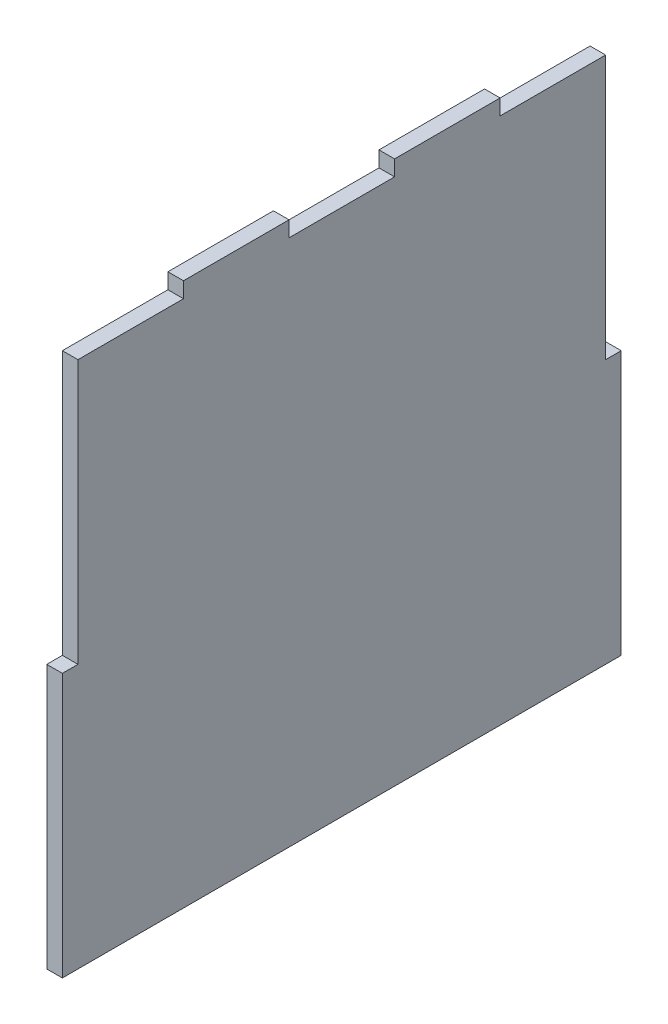
ISO-10303-21;
HEADER;
FILE_DESCRIPTION(('STEP AP214'),'2;1');
FILE_NAME('part.step','',(''),(''),'','','');
FILE_SCHEMA(('AUTOMOTIVE_DESIGN { 1 0 10303 214 1 1 1 1 }'));
ENDSEC;
DATA;
#1=APPLICATION_CONTEXT('core data for automotive mechanical design processes');
#2=APPLICATION_PROTOCOL_DEFINITION('international standard','automotive_design',2000,#1);
#3=PRODUCT_CONTEXT('',#1,'mechanical');
#4=PRODUCT('Part','Part','',(#3));
#5=PRODUCT_RELATED_PRODUCT_CATEGORY('part','',(#4));
#6=PRODUCT_DEFINITION_FORMATION('','',#4);
#7=PRODUCT_DEFINITION_CONTEXT('part definition',#1,'design');
#8=PRODUCT_DEFINITION('design','',#6,#7);
#9=PRODUCT_DEFINITION_SHAPE('','',#8);
#10=(LENGTH_UNIT() NAMED_UNIT(*) SI_UNIT(.MILLI.,.METRE.));
#11=(NAMED_UNIT(*) PLANE_ANGLE_UNIT() SI_UNIT($,.RADIAN.));
#12=(NAMED_UNIT(*) SI_UNIT($,.STERADIAN.) SOLID_ANGLE_UNIT());
#13=UNCERTAINTY_MEASURE_WITH_UNIT(LENGTH_MEASURE(1.E-05),#10,'distance_accuracy_value','');
#14=(GEOMETRIC_REPRESENTATION_CONTEXT(3) GLOBAL_UNCERTAINTY_ASSIGNED_CONTEXT((#13)) GLOBAL_UNIT_ASSIGNED_CONTEXT((#10,
#11,#12)) REPRESENTATION_CONTEXT('',''));
#15=CARTESIAN_POINT('',(0.,0.,0.));
#16=DIRECTION('',(0.,0.,1.));
#17=DIRECTION('',(1.,0.,0.));
#18=AXIS2_PLACEMENT_3D('',#15,#16,#17);
#19=CARTESIAN_POINT('',(3.,0.,-107.6));
#20=DIRECTION('',(0.,1.,0.));
#21=DIRECTION('',(0.,0.,1.));
#22=AXIS2_PLACEMENT_3D('',#19,#20,#21);
#23=PLANE('',#22);
#24=DIRECTION('',(0.,0.,-1.));
#25=VECTOR('',#24,1.);
#26=CARTESIAN_POINT('',(0.,0.,-107.6));
#27=LINE('',#26,#25);
#28=CARTESIAN_POINT('',(0.,0.,0.));
#29=VERTEX_POINT('',#28);
#30=CARTESIAN_POINT('',(0.,0.,-107.6));
#31=VERTEX_POINT('',#30);
#32=EDGE_CURVE('E177',#29,#31,#27,.T.);
#33=ORIENTED_EDGE('',*,*,#32,.T.);
#34=DIRECTION('',(-1.,0.,0.));
#35=VECTOR('',#34,1.);
#36=CARTESIAN_POINT('',(3.,0.,-107.6));
#37=LINE('',#36,#35);
#38=CARTESIAN_POINT('',(3.,0.,-107.6));
#39=VERTEX_POINT('',#38);
#40=EDGE_CURVE('E11',#39,#31,#37,.T.);
#41=ORIENTED_EDGE('',*,*,#40,.F.);
#42=DIRECTION('',(0.,0.,-1.));
#43=VECTOR('',#42,1.);
#44=CARTESIAN_POINT('',(3.,0.,-107.6));
#45=LINE('',#44,#43);
#46=CARTESIAN_POINT('',(3.,0.,0.));
#47=VERTEX_POINT('',#46);
#48=EDGE_CURVE('E207',#47,#39,#45,.T.);
#49=ORIENTED_EDGE('',*,*,#48,.F.);
#50=DIRECTION('',(-1.,0.,0.));
#51=VECTOR('',#50,1.);
#52=CARTESIAN_POINT('',(3.,0.,0.));
#53=LINE('',#52,#51);
#54=EDGE_CURVE('E173',#47,#29,#53,.T.);
#55=ORIENTED_EDGE('',*,*,#54,.T.);
#56=EDGE_LOOP('',(#33,#41,#49,#55));
#57=FACE_BOUND('',#56,.T.);
#58=ADVANCED_FACE('F33',(#57),#23,.F.);
#59=CARTESIAN_POINT('',(3.,50.8,-107.6));
#60=DIRECTION('',(0.,0.,1.));
#61=DIRECTION('',(0.,-1.,0.));
#62=AXIS2_PLACEMENT_3D('',#59,#60,#61);
#63=PLANE('',#62);
#64=DIRECTION('',(0.,1.,0.));
#65=VECTOR('',#64,1.);
#66=CARTESIAN_POINT('',(0.,50.8,-107.6));
#67=LINE('',#66,#65);
#68=CARTESIAN_POINT('',(0.,50.8,-107.6));
#69=VERTEX_POINT('',#68);
#70=EDGE_CURVE('E180',#31,#69,#67,.T.);
#71=ORIENTED_EDGE('',*,*,#70,.T.);
#72=DIRECTION('',(-1.,0.,0.));
#73=VECTOR('',#72,1.);
#74=CARTESIAN_POINT('',(3.,50.8,-107.6));
#75=LINE('',#74,#73);
#76=CARTESIAN_POINT('',(3.,50.8,-107.6));
#77=VERTEX_POINT('',#76);
#78=EDGE_CURVE('E41',#77,#69,#75,.T.);
#79=ORIENTED_EDGE('',*,*,#78,.F.);
#80=DIRECTION('',(0.,1.,0.));
#81=VECTOR('',#80,1.);
#82=CARTESIAN_POINT('',(3.,50.8,-107.6));
#83=LINE('',#82,#81);
#84=EDGE_CURVE('E116',#39,#77,#83,.T.);
#85=ORIENTED_EDGE('',*,*,#84,.F.);
#86=ORIENTED_EDGE('',*,*,#40,.T.);
#87=EDGE_LOOP('',(#71,#79,#85,#86));
#88=FACE_BOUND('',#87,.T.);
#89=ADVANCED_FACE('F305',(#88),#63,.F.);
#90=CARTESIAN_POINT('',(3.,50.8,-104.6));
#91=DIRECTION('',(0.,-1.,0.));
#92=DIRECTION('',(0.,0.,-1.));
#93=AXIS2_PLACEMENT_3D('',#90,#91,#92);
#94=PLANE('',#93);
#95=DIRECTION('',(0.,0.,1.));
#96=VECTOR('',#95,1.);
#97=CARTESIAN_POINT('',(0.,50.8,-104.6));
#98=LINE('',#97,#96);
#99=CARTESIAN_POINT('',(0.,50.8,-104.6));
#100=VERTEX_POINT('',#99);
#101=EDGE_CURVE('E182',#69,#100,#98,.T.);
#102=ORIENTED_EDGE('',*,*,#101,.T.);
#103=DIRECTION('',(-1.,0.,0.));
#104=VECTOR('',#103,1.);
#105=CARTESIAN_POINT('',(3.,50.8,-104.6));
#106=LINE('',#105,#104);
#107=CARTESIAN_POINT('',(3.,50.8,-104.6));
#108=VERTEX_POINT('',#107);
#109=EDGE_CURVE('E238',#108,#100,#106,.T.);
#110=ORIENTED_EDGE('',*,*,#109,.F.);
#111=DIRECTION('',(0.,0.,1.));
#112=VECTOR('',#111,1.);
#113=CARTESIAN_POINT('',(3.,50.8,-104.6));
#114=LINE('',#113,#112);
#115=EDGE_CURVE('E246',#77,#108,#114,.T.);
#116=ORIENTED_EDGE('',*,*,#115,.F.);
#117=ORIENTED_EDGE('',*,*,#78,.T.);
#118=EDGE_LOOP('',(#102,#110,#116,#117));
#119=FACE_BOUND('',#118,.T.);
#120=ADVANCED_FACE('F244',(#119),#94,.F.);
#121=CARTESIAN_POINT('',(3.,101.6,-104.6));
#122=DIRECTION('',(0.,0.,1.));
#123=DIRECTION('',(0.,-1.,0.));
#124=AXIS2_PLACEMENT_3D('',#121,#122,#123);
#125=PLANE('',#124);
#126=DIRECTION('',(0.,1.,0.));
#127=VECTOR('',#126,1.);
#128=CARTESIAN_POINT('',(0.,101.6,-104.6));
#129=LINE('',#128,#127);
#130=CARTESIAN_POINT('',(0.,101.6,-104.6));
#131=VERTEX_POINT('',#130);
#132=EDGE_CURVE('E184',#100,#131,#129,.T.);
#133=ORIENTED_EDGE('',*,*,#132,.T.);
#134=DIRECTION('',(-1.,0.,0.));
#135=VECTOR('',#134,1.);
#136=CARTESIAN_POINT('',(3.,101.6,-104.6));
#137=LINE('',#136,#135);
#138=CARTESIAN_POINT('',(3.,101.6,-104.6));
#139=VERTEX_POINT('',#138);
#140=EDGE_CURVE('E235',#139,#131,#137,.T.);
#141=ORIENTED_EDGE('',*,*,#140,.F.);
#142=DIRECTION('',(0.,1.,0.));
#143=VECTOR('',#142,1.);
#144=CARTESIAN_POINT('',(3.,101.6,-104.6));
#145=LINE('',#144,#143);
#146=EDGE_CURVE('E264',#108,#139,#145,.T.);
#147=ORIENTED_EDGE('',*,*,#146,.F.);
#148=ORIENTED_EDGE('',*,*,#109,.T.);
#149=EDGE_LOOP('',(#133,#141,#147,#148));
#150=FACE_BOUND('',#149,.T.);
#151=ADVANCED_FACE('F255',(#150),#125,.F.);
#152=CARTESIAN_POINT('',(3.,101.6,-84.28));
#153=DIRECTION('',(0.,-1.,0.));
#154=DIRECTION('',(0.,0.,-1.));
#155=AXIS2_PLACEMENT_3D('',#152,#153,#154);
#156=PLANE('',#155);
#157=DIRECTION('',(0.,0.,1.));
#158=VECTOR('',#157,1.);
#159=CARTESIAN_POINT('',(0.,101.6,-84.28));
#160=LINE('',#159,#158);
#161=CARTESIAN_POINT('',(0.,101.6,-84.28));
#162=VERTEX_POINT('',#161);
#163=EDGE_CURVE('E186',#131,#162,#160,.T.);
#164=ORIENTED_EDGE('',*,*,#163,.T.);
#165=DIRECTION('',(-1.,0.,0.));
#166=VECTOR('',#165,1.);
#167=CARTESIAN_POINT('',(3.,101.6,-84.28));
#168=LINE('',#167,#166);
#169=CARTESIAN_POINT('',(3.,101.6,-84.28));
#170=VERTEX_POINT('',#169);
#171=EDGE_CURVE('E232',#170,#162,#168,.T.);
#172=ORIENTED_EDGE('',*,*,#171,.F.);
#173=DIRECTION('',(0.,0.,1.));
#174=VECTOR('',#173,1.);
#175=CARTESIAN_POINT('',(3.,101.6,-84.28));
#176=LINE('',#175,#174);
#177=EDGE_CURVE('E261',#139,#170,#176,.T.);
#178=ORIENTED_EDGE('',*,*,#177,.F.);
#179=ORIENTED_EDGE('',*,*,#140,.T.);
#180=EDGE_LOOP('',(#164,#172,#178,#179));
#181=FACE_BOUND('',#180,.T.);
#182=ADVANCED_FACE('F259',(#181),#156,.F.);
#183=CARTESIAN_POINT('',(3.,104.6,-84.28));
#184=DIRECTION('',(0.,0.,1.));
#185=DIRECTION('',(0.,-1.,0.));
#186=AXIS2_PLACEMENT_3D('',#183,#184,#185);
#187=PLANE('',#186);
#188=DIRECTION('',(0.,1.,0.));
#189=VECTOR('',#188,1.);
#190=CARTESIAN_POINT('',(0.,104.6,-84.28));
#191=LINE('',#190,#189);
#192=CARTESIAN_POINT('',(0.,104.6,-84.28));
#193=VERTEX_POINT('',#192);
#194=EDGE_CURVE('E188',#162,#193,#191,.T.);
#195=ORIENTED_EDGE('',*,*,#194,.T.);
#196=DIRECTION('',(-1.,0.,0.));
#197=VECTOR('',#196,1.);
#198=CARTESIAN_POINT('',(3.,104.6,-84.28));
#199=LINE('',#198,#197);
#200=CARTESIAN_POINT('',(3.,104.6,-84.28));
#201=VERTEX_POINT('',#200);
#202=EDGE_CURVE('E229',#201,#193,#199,.T.);
#203=ORIENTED_EDGE('',*,*,#202,.F.);
#204=DIRECTION('',(0.,1.,0.));
#205=VECTOR('',#204,1.);
#206=CARTESIAN_POINT('',(3.,104.6,-84.28));
#207=LINE('',#206,#205);
#208=EDGE_CURVE('E263',#170,#201,#207,.T.);
#209=ORIENTED_EDGE('',*,*,#208,.F.);
#210=ORIENTED_EDGE('',*,*,#171,.T.);
#211=EDGE_LOOP('',(#195,#203,#209,#210));
#212=FACE_BOUND('',#211,.T.);
#213=ADVANCED_FACE('F318',(#212),#187,.F.);
#214=CARTESIAN_POINT('',(3.,104.6,-63.96));
#215=DIRECTION('',(0.,-1.,0.));
#216=DIRECTION('',(0.,0.,-1.));
#217=AXIS2_PLACEMENT_3D('',#214,#215,#216);
#218=PLANE('',#217);
#219=DIRECTION('',(0.,0.,1.));
#220=VECTOR('',#219,1.);
#221=CARTESIAN_POINT('',(0.,104.6,-63.96));
#222=LINE('',#221,#220);
#223=CARTESIAN_POINT('',(0.,104.6,-63.96));
#224=VERTEX_POINT('',#223);
#225=EDGE_CURVE('E190',#193,#224,#222,.T.);
#226=ORIENTED_EDGE('',*,*,#225,.T.);
#227=DIRECTION('',(-1.,0.,0.));
#228=VECTOR('',#227,1.);
#229=CARTESIAN_POINT('',(3.,104.6,-63.96));
#230=LINE('',#229,#228);
#231=CARTESIAN_POINT('',(3.,104.6,-63.96));
#232=VERTEX_POINT('',#231);
#233=EDGE_CURVE('E226',#232,#224,#230,.T.);
#234=ORIENTED_EDGE('',*,*,#233,.F.);
#235=DIRECTION('',(0.,0.,1.));
#236=VECTOR('',#235,1.);
#237=CARTESIAN_POINT('',(3.,104.6,-63.96));
#238=LINE('',#237,#236);
#239=EDGE_CURVE('E266',#201,#232,#238,.T.);
#240=ORIENTED_EDGE('',*,*,#239,.F.);
#241=ORIENTED_EDGE('',*,*,#202,.T.);
#242=EDGE_LOOP('',(#226,#234,#240,#241));
#243=FACE_BOUND('',#242,.T.);
#244=ADVANCED_FACE('F321',(#243),#218,.F.);
#245=CARTESIAN_POINT('',(3.,101.6,-63.96));
#246=DIRECTION('',(0.,0.,-1.));
#247=DIRECTION('',(-1.,0.,0.));
#248=AXIS2_PLACEMENT_3D('',#245,#246,#247);
#249=PLANE('',#248);
#250=DIRECTION('',(0.,-1.,0.));
#251=VECTOR('',#250,1.);
#252=CARTESIAN_POINT('',(0.,101.6,-63.96));
#253=LINE('',#252,#251);
#254=CARTESIAN_POINT('',(0.,101.6,-63.96));
#255=VERTEX_POINT('',#254);
#256=EDGE_CURVE('E192',#224,#255,#253,.T.);
#257=ORIENTED_EDGE('',*,*,#256,.T.);
#258=DIRECTION('',(-1.,0.,0.));
#259=VECTOR('',#258,1.);
#260=CARTESIAN_POINT('',(3.,101.6,-63.96));
#261=LINE('',#260,#259);
#262=CARTESIAN_POINT('',(3.,101.6,-63.96));
#263=VERTEX_POINT('',#262);
#264=EDGE_CURVE('E223',#263,#255,#261,.T.);
#265=ORIENTED_EDGE('',*,*,#264,.F.);
#266=DIRECTION('',(0.,-1.,0.));
#267=VECTOR('',#266,1.);
#268=CARTESIAN_POINT('',(3.,101.6,-63.96));
#269=LINE('',#268,#267);
#270=EDGE_CURVE('E272',#232,#263,#269,.T.);
#271=ORIENTED_EDGE('',*,*,#270,.F.);
#272=ORIENTED_EDGE('',*,*,#233,.T.);
#273=EDGE_LOOP('',(#257,#265,#271,#272));
#274=FACE_BOUND('',#273,.T.);
#275=ADVANCED_FACE('F325',(#274),#249,.F.);
#276=CARTESIAN_POINT('',(3.,101.6,-43.64));
#277=DIRECTION('',(0.,-1.,0.));
#278=DIRECTION('',(0.,0.,-1.));
#279=AXIS2_PLACEMENT_3D('',#276,#277,#278);
#280=PLANE('',#279);
#281=DIRECTION('',(0.,0.,1.));
#282=VECTOR('',#281,1.);
#283=CARTESIAN_POINT('',(0.,101.6,-43.64));
#284=LINE('',#283,#282);
#285=CARTESIAN_POINT('',(0.,101.6,-43.64));
#286=VERTEX_POINT('',#285);
#287=EDGE_CURVE('E194',#255,#286,#284,.T.);
#288=ORIENTED_EDGE('',*,*,#287,.T.);
#289=DIRECTION('',(-1.,0.,0.));
#290=VECTOR('',#289,1.);
#291=CARTESIAN_POINT('',(3.,101.6,-43.64));
#292=LINE('',#291,#290);
#293=CARTESIAN_POINT('',(3.,101.6,-43.64));
#294=VERTEX_POINT('',#293);
#295=EDGE_CURVE('E220',#294,#286,#292,.T.);
#296=ORIENTED_EDGE('',*,*,#295,.F.);
#297=DIRECTION('',(0.,0.,1.));
#298=VECTOR('',#297,1.);
#299=CARTESIAN_POINT('',(3.,101.6,-43.64));
#300=LINE('',#299,#298);
#301=EDGE_CURVE('E274',#263,#294,#300,.T.);
#302=ORIENTED_EDGE('',*,*,#301,.F.);
#303=ORIENTED_EDGE('',*,*,#264,.T.);
#304=EDGE_LOOP('',(#288,#296,#302,#303));
#305=FACE_BOUND('',#304,.T.);
#306=ADVANCED_FACE('F329',(#305),#280,.F.);
#307=CARTESIAN_POINT('',(3.,104.6,-43.64));
#308=DIRECTION('',(0.,0.,1.));
#309=DIRECTION('',(1.,0.,0.));
#310=AXIS2_PLACEMENT_3D('',#307,#308,#309);
#311=PLANE('',#310);
#312=DIRECTION('',(0.,1.,0.));
#313=VECTOR('',#312,1.);
#314=CARTESIAN_POINT('',(0.,104.6,-43.64));
#315=LINE('',#314,#313);
#316=CARTESIAN_POINT('',(0.,104.6,-43.64));
#317=VERTEX_POINT('',#316);
#318=EDGE_CURVE('E196',#286,#317,#315,.T.);
#319=ORIENTED_EDGE('',*,*,#318,.T.);
#320=DIRECTION('',(-1.,0.,0.));
#321=VECTOR('',#320,1.);
#322=CARTESIAN_POINT('',(3.,104.6,-43.64));
#323=LINE('',#322,#321);
#324=CARTESIAN_POINT('',(3.,104.6,-43.64));
#325=VERTEX_POINT('',#324);
#326=EDGE_CURVE('E217',#325,#317,#323,.T.);
#327=ORIENTED_EDGE('',*,*,#326,.F.);
#328=DIRECTION('',(0.,1.,0.));
#329=VECTOR('',#328,1.);
#330=CARTESIAN_POINT('',(3.,104.6,-43.64));
#331=LINE('',#330,#329);
#332=EDGE_CURVE('E276',#294,#325,#331,.T.);
#333=ORIENTED_EDGE('',*,*,#332,.F.);
#334=ORIENTED_EDGE('',*,*,#295,.T.);
#335=EDGE_LOOP('',(#319,#327,#333,#334));
#336=FACE_BOUND('',#335,.T.);
#337=ADVANCED_FACE('F333',(#336),#311,.F.);
#338=CARTESIAN_POINT('',(3.,104.6,-23.32));
#339=DIRECTION('',(0.,-1.,0.));
#340=DIRECTION('',(0.,0.,-1.));
#341=AXIS2_PLACEMENT_3D('',#338,#339,#340);
#342=PLANE('',#341);
#343=DIRECTION('',(0.,0.,1.));
#344=VECTOR('',#343,1.);
#345=CARTESIAN_POINT('',(0.,104.6,-23.32));
#346=LINE('',#345,#344);
#347=CARTESIAN_POINT('',(0.,104.6,-23.32));
#348=VERTEX_POINT('',#347);
#349=EDGE_CURVE('E198',#317,#348,#346,.T.);
#350=ORIENTED_EDGE('',*,*,#349,.T.);
#351=DIRECTION('',(-1.,0.,0.));
#352=VECTOR('',#351,1.);
#353=CARTESIAN_POINT('',(3.,104.6,-23.32));
#354=LINE('',#353,#352);
#355=CARTESIAN_POINT('',(3.,104.6,-23.32));
#356=VERTEX_POINT('',#355);
#357=EDGE_CURVE('E214',#356,#348,#354,.T.);
#358=ORIENTED_EDGE('',*,*,#357,.F.);
#359=DIRECTION('',(0.,0.,1.));
#360=VECTOR('',#359,1.);
#361=CARTESIAN_POINT('',(3.,104.6,-23.32));
#362=LINE('',#361,#360);
#363=EDGE_CURVE('E278',#325,#356,#362,.T.);
#364=ORIENTED_EDGE('',*,*,#363,.F.);
#365=ORIENTED_EDGE('',*,*,#326,.T.);
#366=EDGE_LOOP('',(#350,#358,#364,#365));
#367=FACE_BOUND('',#366,.T.);
#368=ADVANCED_FACE('F337',(#367),#342,.F.);
#369=CARTESIAN_POINT('',(3.,101.6,-23.32));
#370=DIRECTION('',(0.,0.,-1.));
#371=DIRECTION('',(-1.,0.,0.));
#372=AXIS2_PLACEMENT_3D('',#369,#370,#371);
#373=PLANE('',#372);
#374=DIRECTION('',(0.,-1.,0.));
#375=VECTOR('',#374,1.);
#376=CARTESIAN_POINT('',(0.,101.6,-23.32));
#377=LINE('',#376,#375);
#378=CARTESIAN_POINT('',(0.,101.6,-23.32));
#379=VERTEX_POINT('',#378);
#380=EDGE_CURVE('E200',#348,#379,#377,.T.);
#381=ORIENTED_EDGE('',*,*,#380,.T.);
#382=DIRECTION('',(-1.,0.,0.));
#383=VECTOR('',#382,1.);
#384=CARTESIAN_POINT('',(3.,101.6,-23.32));
#385=LINE('',#384,#383);
#386=CARTESIAN_POINT('',(3.,101.6,-23.32));
#387=VERTEX_POINT('',#386);
#388=EDGE_CURVE('E211',#387,#379,#385,.T.);
#389=ORIENTED_EDGE('',*,*,#388,.F.);
#390=DIRECTION('',(0.,-1.,0.));
#391=VECTOR('',#390,1.);
#392=CARTESIAN_POINT('',(3.,101.6,-23.32));
#393=LINE('',#392,#391);
#394=EDGE_CURVE('E280',#356,#387,#393,.T.);
#395=ORIENTED_EDGE('',*,*,#394,.F.);
#396=ORIENTED_EDGE('',*,*,#357,.T.);
#397=EDGE_LOOP('',(#381,#389,#395,#396));
#398=FACE_BOUND('',#397,.T.);
#399=ADVANCED_FACE('F286',(#398),#373,.F.);
#400=CARTESIAN_POINT('',(3.,101.6,-2.99999999999999));
#401=DIRECTION('',(0.,-1.,0.));
#402=DIRECTION('',(0.,0.,-1.));
#403=AXIS2_PLACEMENT_3D('',#400,#401,#402);
#404=PLANE('',#403);
#405=DIRECTION('',(0.,0.,1.));
#406=VECTOR('',#405,1.);
#407=CARTESIAN_POINT('',(0.,101.6,-2.99999999999999));
#408=LINE('',#407,#406);
#409=CARTESIAN_POINT('',(0.,101.6,-2.99999999999999));
#410=VERTEX_POINT('',#409);
#411=EDGE_CURVE('E202',#379,#410,#408,.T.);
#412=ORIENTED_EDGE('',*,*,#411,.T.);
#413=DIRECTION('',(-1.,0.,0.));
#414=VECTOR('',#413,1.);
#415=CARTESIAN_POINT('',(3.,101.6,-2.99999999999999));
#416=LINE('',#415,#414);
#417=CARTESIAN_POINT('',(3.,101.6,-2.99999999999999));
#418=VERTEX_POINT('',#417);
#419=EDGE_CURVE('E168',#418,#410,#416,.T.);
#420=ORIENTED_EDGE('',*,*,#419,.F.);
#421=DIRECTION('',(0.,0.,1.));
#422=VECTOR('',#421,1.);
#423=CARTESIAN_POINT('',(3.,101.6,-2.99999999999999));
#424=LINE('',#423,#422);
#425=EDGE_CURVE('E159',#387,#418,#424,.T.);
#426=ORIENTED_EDGE('',*,*,#425,.F.);
#427=ORIENTED_EDGE('',*,*,#388,.T.);
#428=EDGE_LOOP('',(#412,#420,#426,#427));
#429=FACE_BOUND('',#428,.T.);
#430=ADVANCED_FACE('F290',(#429),#404,.F.);
#431=CARTESIAN_POINT('',(3.,50.8,-2.99999999999999));
#432=DIRECTION('',(0.,0.,-1.));
#433=DIRECTION('',(0.,1.,0.));
#434=AXIS2_PLACEMENT_3D('',#431,#432,#433);
#435=PLANE('',#434);
#436=DIRECTION('',(0.,-1.,0.));
#437=VECTOR('',#436,1.);
#438=CARTESIAN_POINT('',(0.,50.8,-2.99999999999999));
#439=LINE('',#438,#437);
#440=CARTESIAN_POINT('',(0.,50.8,-2.99999999999999));
#441=VERTEX_POINT('',#440);
#442=EDGE_CURVE('E167',#410,#441,#439,.T.);
#443=ORIENTED_EDGE('',*,*,#442,.T.);
#444=DIRECTION('',(-1.,0.,0.));
#445=VECTOR('',#444,1.);
#446=CARTESIAN_POINT('',(3.,50.8,-2.99999999999999));
#447=LINE('',#446,#445);
#448=CARTESIAN_POINT('',(3.,50.8,-2.99999999999999));
#449=VERTEX_POINT('',#448);
#450=EDGE_CURVE('E164',#449,#441,#447,.T.);
#451=ORIENTED_EDGE('',*,*,#450,.F.);
#452=DIRECTION('',(0.,-1.,0.));
#453=VECTOR('',#452,1.);
#454=CARTESIAN_POINT('',(3.,50.8,-2.99999999999999));
#455=LINE('',#454,#453);
#456=EDGE_CURVE('E153',#418,#449,#455,.T.);
#457=ORIENTED_EDGE('',*,*,#456,.F.);
#458=ORIENTED_EDGE('',*,*,#419,.T.);
#459=EDGE_LOOP('',(#443,#451,#457,#458));
#460=FACE_BOUND('',#459,.T.);
#461=ADVANCED_FACE('F165',(#460),#435,.F.);
#462=CARTESIAN_POINT('',(3.,50.8,0.));
#463=DIRECTION('',(0.,-1.,0.));
#464=DIRECTION('',(0.,0.,-1.));
#465=AXIS2_PLACEMENT_3D('',#462,#463,#464);
#466=PLANE('',#465);
#467=DIRECTION('',(0.,0.,1.));
#468=VECTOR('',#467,1.);
#469=CARTESIAN_POINT('',(0.,50.8,0.));
#470=LINE('',#469,#468);
#471=CARTESIAN_POINT('',(0.,50.8,0.));
#472=VERTEX_POINT('',#471);
#473=EDGE_CURVE('E102',#441,#472,#470,.T.);
#474=ORIENTED_EDGE('',*,*,#473,.T.);
#475=DIRECTION('',(-1.,0.,0.));
#476=VECTOR('',#475,1.);
#477=CARTESIAN_POINT('',(3.,50.8,0.));
#478=LINE('',#477,#476);
#479=CARTESIAN_POINT('',(3.,50.8,0.));
#480=VERTEX_POINT('',#479);
#481=EDGE_CURVE('E169',#480,#472,#478,.T.);
#482=ORIENTED_EDGE('',*,*,#481,.F.);
#483=DIRECTION('',(0.,0.,1.));
#484=VECTOR('',#483,1.);
#485=CARTESIAN_POINT('',(3.,50.8,0.));
#486=LINE('',#485,#484);
#487=EDGE_CURVE('E157',#449,#480,#486,.T.);
#488=ORIENTED_EDGE('',*,*,#487,.F.);
#489=ORIENTED_EDGE('',*,*,#450,.T.);
#490=EDGE_LOOP('',(#474,#482,#488,#489));
#491=FACE_BOUND('',#490,.T.);
#492=ADVANCED_FACE('F171',(#491),#466,.F.);
#493=CARTESIAN_POINT('',(3.,0.,0.));
#494=DIRECTION('',(0.,0.,-1.));
#495=DIRECTION('',(-1.,0.,0.));
#496=AXIS2_PLACEMENT_3D('',#493,#494,#495);
#497=PLANE('',#496);
#498=DIRECTION('',(0.,-1.,0.));
#499=VECTOR('',#498,1.);
#500=CARTESIAN_POINT('',(0.,0.,0.));
#501=LINE('',#500,#499);
#502=EDGE_CURVE('E108',#472,#29,#501,.T.);
#503=ORIENTED_EDGE('',*,*,#502,.T.);
#504=ORIENTED_EDGE('',*,*,#54,.F.);
#505=DIRECTION('',(0.,-1.,0.));
#506=VECTOR('',#505,1.);
#507=CARTESIAN_POINT('',(3.,0.,0.));
#508=LINE('',#507,#506);
#509=EDGE_CURVE('E49',#480,#47,#508,.T.);
#510=ORIENTED_EDGE('',*,*,#509,.F.);
#511=ORIENTED_EDGE('',*,*,#481,.T.);
#512=EDGE_LOOP('',(#503,#504,#510,#511));
#513=FACE_BOUND('',#512,.T.);
#514=ADVANCED_FACE('F294',(#513),#497,.F.);
#515=CARTESIAN_POINT('',(3.,0.,0.));
#516=DIRECTION('',(-1.,0.,0.));
#517=DIRECTION('',(0.,0.,1.));
#518=AXIS2_PLACEMENT_3D('',#515,#516,#517);
#519=PLANE('',#518);
#520=ORIENTED_EDGE('',*,*,#48,.T.);
#521=ORIENTED_EDGE('',*,*,#84,.T.);
#522=ORIENTED_EDGE('',*,*,#115,.T.);
#523=ORIENTED_EDGE('',*,*,#146,.T.);
#524=ORIENTED_EDGE('',*,*,#177,.T.);
#525=ORIENTED_EDGE('',*,*,#208,.T.);
#526=ORIENTED_EDGE('',*,*,#239,.T.);
#527=ORIENTED_EDGE('',*,*,#270,.T.);
#528=ORIENTED_EDGE('',*,*,#301,.T.);
#529=ORIENTED_EDGE('',*,*,#332,.T.);
#530=ORIENTED_EDGE('',*,*,#363,.T.);
#531=ORIENTED_EDGE('',*,*,#394,.T.);
#532=ORIENTED_EDGE('',*,*,#425,.T.);
#533=ORIENTED_EDGE('',*,*,#456,.T.);
#534=ORIENTED_EDGE('',*,*,#487,.T.);
#535=ORIENTED_EDGE('',*,*,#509,.T.);
#536=EDGE_LOOP('',(#520,#521,#522,#523,#524,#525,#526,#527,#528,#529,#530,#531,#532,#533,#534,#535));
#537=FACE_BOUND('',#536,.T.);
#538=ADVANCED_FACE('F155',(#537),#519,.F.);
#539=CARTESIAN_POINT('',(0.,0.,0.));
#540=DIRECTION('',(-1.,0.,0.));
#541=DIRECTION('',(0.,0.,1.));
#542=AXIS2_PLACEMENT_3D('',#539,#540,#541);
#543=PLANE('',#542);
#544=ORIENTED_EDGE('',*,*,#32,.F.);
#545=ORIENTED_EDGE('',*,*,#502,.F.);
#546=ORIENTED_EDGE('',*,*,#473,.F.);
#547=ORIENTED_EDGE('',*,*,#442,.F.);
#548=ORIENTED_EDGE('',*,*,#411,.F.);
#549=ORIENTED_EDGE('',*,*,#380,.F.);
#550=ORIENTED_EDGE('',*,*,#349,.F.);
#551=ORIENTED_EDGE('',*,*,#318,.F.);
#552=ORIENTED_EDGE('',*,*,#287,.F.);
#553=ORIENTED_EDGE('',*,*,#256,.F.);
#554=ORIENTED_EDGE('',*,*,#225,.F.);
#555=ORIENTED_EDGE('',*,*,#194,.F.);
#556=ORIENTED_EDGE('',*,*,#163,.F.);
#557=ORIENTED_EDGE('',*,*,#132,.F.);
#558=ORIENTED_EDGE('',*,*,#101,.F.);
#559=ORIENTED_EDGE('',*,*,#70,.F.);
#560=EDGE_LOOP('',(#544,#545,#546,#547,#548,#549,#550,#551,#552,#553,#554,#555,#556,#557,#558,#559));
#561=FACE_BOUND('',#560,.T.);
#562=ADVANCED_FACE('F250',(#561),#543,.T.);
#563=CLOSED_SHELL('',(#58,#89,#120,#151,#182,#213,#244,#275,#306,#337,#368,#399,#430,#461,#492,
#514,#538,#562));
#564=MANIFOLD_SOLID_BREP('B2',#563);
#565=ADVANCED_BREP_SHAPE_REPRESENTATION('',(#18,#564),#14);
#566=SHAPE_DEFINITION_REPRESENTATION(#9,#565);
ENDSEC;
END-ISO-10303-21;
